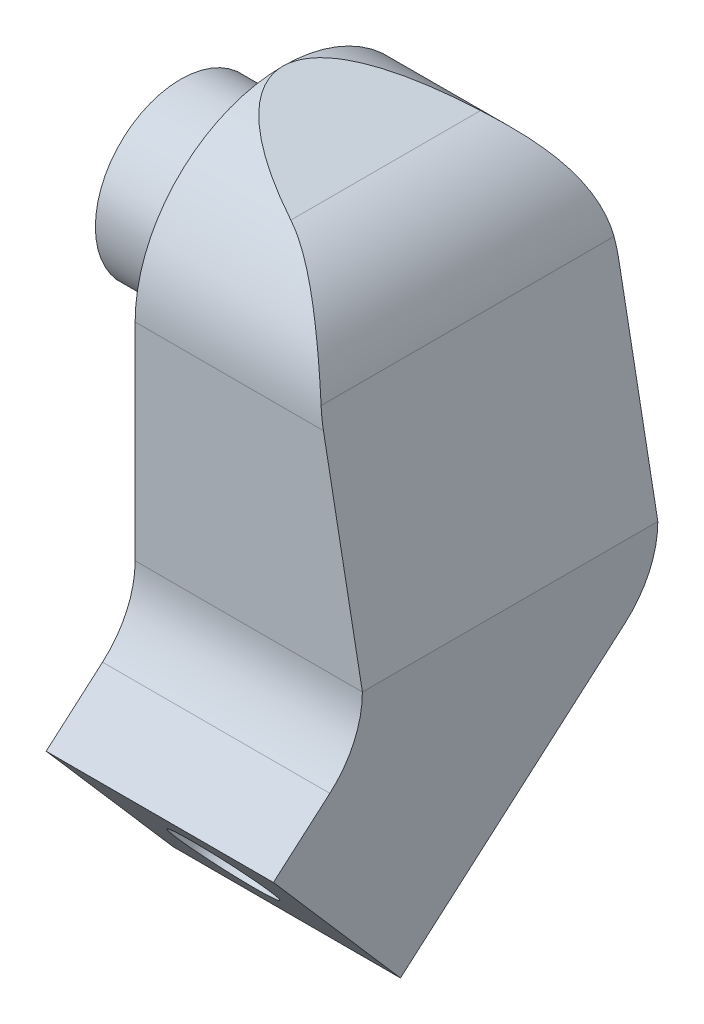
ISO-10303-21;
HEADER;
FILE_DESCRIPTION(('STEP AP214'),'2;1');
FILE_NAME('part.step','',(''),(''),'','','');
FILE_SCHEMA(('AUTOMOTIVE_DESIGN { 1 0 10303 214 1 1 1 1 }'));
ENDSEC;
DATA;
#1=APPLICATION_CONTEXT('core data for automotive mechanical design processes');
#2=APPLICATION_PROTOCOL_DEFINITION('international standard','automotive_design',2000,#1);
#3=PRODUCT_CONTEXT('',#1,'mechanical');
#4=PRODUCT('Part','Part','',(#3));
#5=PRODUCT_RELATED_PRODUCT_CATEGORY('part','',(#4));
#6=PRODUCT_DEFINITION_FORMATION('','',#4);
#7=PRODUCT_DEFINITION_CONTEXT('part definition',#1,'design');
#8=PRODUCT_DEFINITION('design','',#6,#7);
#9=PRODUCT_DEFINITION_SHAPE('','',#8);
#10=(LENGTH_UNIT() NAMED_UNIT(*) SI_UNIT(.MILLI.,.METRE.));
#11=(NAMED_UNIT(*) PLANE_ANGLE_UNIT() SI_UNIT($,.RADIAN.));
#12=(NAMED_UNIT(*) SI_UNIT($,.STERADIAN.) SOLID_ANGLE_UNIT());
#13=UNCERTAINTY_MEASURE_WITH_UNIT(LENGTH_MEASURE(1.E-05),#10,'distance_accuracy_value','');
#14=(GEOMETRIC_REPRESENTATION_CONTEXT(3) GLOBAL_UNCERTAINTY_ASSIGNED_CONTEXT((#13)) GLOBAL_UNIT_ASSIGNED_CONTEXT((#10,
#11,#12)) REPRESENTATION_CONTEXT('',''));
#15=CARTESIAN_POINT('',(0.,0.,0.));
#16=DIRECTION('',(0.,0.,1.));
#17=DIRECTION('',(1.,0.,0.));
#18=AXIS2_PLACEMENT_3D('',#15,#16,#17);
#19=CARTESIAN_POINT('',(6.,9.24472259806208,0.));
#20=DIRECTION('',(-1.,0.,0.));
#21=DIRECTION('',(0.,0.,1.));
#22=AXIS2_PLACEMENT_3D('',#19,#20,#21);
#23=CYLINDRICAL_SURFACE('',#22,7.8);
#24=CARTESIAN_POINT('',(-0.569888599863877,15.2243930559261,-5.00834715403681));
#25=CARTESIAN_POINT('',(-0.474869123652778,15.1925352213,-5.04638719464826));
#26=CARTESIAN_POINT('',(-0.381202871972687,15.158696050549,-5.08604791135388));
#27=CARTESIAN_POINT('',(-0.196562427398851,15.0872049518383,-5.16801210876022));
#28=CARTESIAN_POINT('',(-0.105587238832292,15.0495544574296,-5.21031459353764));
#29=CARTESIAN_POINT('',(0.163180124105426,14.9311819955664,-5.34021232860646));
#30=CARTESIAN_POINT('',(0.337076939679802,14.8449500549864,-5.43090643915444));
#31=CARTESIAN_POINT('',(0.675412376514924,14.6581481137479,-5.6171453697422));
#32=CARTESIAN_POINT('',(0.839804757384013,14.5575151447878,-5.71271023888794));
#33=CARTESIAN_POINT('',(1.15851280873125,14.3425197954466,-5.90536280209067));
#34=CARTESIAN_POINT('',(1.31282477114693,14.2281524063063,-6.00245104041017));
#35=CARTESIAN_POINT('',(1.61053493916151,13.9863599569609,-6.19521549453902));
#36=CARTESIAN_POINT('',(1.75397393804205,13.8589883909078,-6.29089577910444));
#37=CARTESIAN_POINT('',(2.03010271828314,13.5908835350614,-6.47902014934132));
#38=CARTESIAN_POINT('',(2.16279304431132,13.4501509230987,-6.57146439885746));
#39=CARTESIAN_POINT('',(2.41639993311986,13.1556294682544,-6.7508891111499));
#40=CARTESIAN_POINT('',(2.5373331723654,13.0018597150877,-6.83787724889714));
#41=CARTESIAN_POINT('',(2.76644673797915,12.681360140192,-7.00443491958694));
#42=CARTESIAN_POINT('',(2.8746314973217,12.5146348570974,-7.08400702924866));
#43=CARTESIAN_POINT('',(3.05190884759063,12.2113645915138,-7.21520744558215));
#44=CARTESIAN_POINT('',(3.12406878528015,12.0774936643756,-7.2688926254316));
#45=CARTESIAN_POINT('',(3.25961273719689,11.8031018963422,-7.36994263402898));
#46=CARTESIAN_POINT('',(3.32299897980834,11.6625827562022,-7.41730906753061));
#47=CARTESIAN_POINT('',(3.44010779408202,11.3758342613788,-7.50471678363874));
#48=CARTESIAN_POINT('',(3.49385550569836,11.2296210091986,-7.54477712733281));
#49=CARTESIAN_POINT('',(3.59113277117575,10.9319725815418,-7.61686283034689));
#50=CARTESIAN_POINT('',(3.63466922388612,10.7805410114146,-7.64889361554565));
#51=CARTESIAN_POINT('',(3.68762857824843,10.5671411865185,-7.68732197202193));
#52=CARTESIAN_POINT('',(3.7016618308161,10.5069429876775,-7.69743785534594));
#53=CARTESIAN_POINT('',(3.72803925954416,10.3859903636672,-7.71629772987771));
#54=CARTESIAN_POINT('',(3.74038410740754,10.3252361700141,-7.72504226685639));
#55=CARTESIAN_POINT('',(3.75187311922548,10.2642194353368,-7.73308646006152));
#56=B_SPLINE_CURVE_WITH_KNOTS('',3,(#24,#25,#26,#27,#28,#29,#30,#31,#32,#33,#34,#35,#36,#37,#38,
#39,#40,#41,#42,#43,#44,#45,#46,#47,#48,#49,#50,#51,#52,#53,#54,#55),.UNSPECIFIED.,.F.,.F.,(4,2,
2,2,2,2,2,2,2,2,2,2,2,2,2,4),(0.,0.321486333116528,0.642852191921794,1.28469364964235,
1.92943253957461,2.57440727527911,3.21682826619508,3.85921668331311,4.50068020813563,
5.141920017254,5.62530529136211,6.10856756684329,6.5905504222528,7.07220670016877,
7.26007797088733,7.44787428146098),.UNSPECIFIED.);
#57=CARTESIAN_POINT('',(-0.569888599863877,15.2243930559261,-5.00834715403681));
#58=VERTEX_POINT('',#57);
#59=CARTESIAN_POINT('',(3.75187311922548,10.2642194353368,-7.73308646006152));
#60=VERTEX_POINT('',#59);
#61=EDGE_CURVE('E11',#58,#60,#56,.T.);
#62=ORIENTED_EDGE('',*,*,#61,.T.);
#63=CARTESIAN_POINT('',(3.94383489943073,9.24472259806208,0.));
#64=DIRECTION('',(-0.98273115117596,-0.185039143178876,0.));
#65=DIRECTION('',(-0.185039143178876,0.98273115117596,0.));
#66=AXIS2_PLACEMENT_3D('',#63,#64,#65);
#67=ELLIPSE('',#66,7.93706395759037,7.8);
#68=CARTESIAN_POINT('',(3.94383489943073,9.24472259806208,-7.8));
#69=VERTEX_POINT('',#68);
#70=EDGE_CURVE('E142',#60,#69,#67,.T.);
#71=ORIENTED_EDGE('',*,*,#70,.T.);
#72=DIRECTION('',(-1.,0.,0.));
#73=VECTOR('',#72,1.);
#74=CARTESIAN_POINT('',(6.,9.24472259806208,-7.8));
#75=LINE('',#74,#73);
#76=CARTESIAN_POINT('',(-6.,9.24472259806208,-7.8));
#77=VERTEX_POINT('',#76);
#78=EDGE_CURVE('E165',#69,#77,#75,.T.);
#79=ORIENTED_EDGE('',*,*,#78,.T.);
#80=CARTESIAN_POINT('',(-6.,9.24472259806208,0.));
#81=DIRECTION('',(1.,0.,0.));
#82=DIRECTION('',(0.,0.,-1.));
#83=AXIS2_PLACEMENT_3D('',#80,#81,#82);
#84=CIRCLE('',#83,7.8);
#85=CARTESIAN_POINT('',(-6.,17.0447225980621,0.));
#86=VERTEX_POINT('',#85);
#87=EDGE_CURVE('E146',#77,#86,#84,.T.);
#88=ORIENTED_EDGE('',*,*,#87,.T.);
#89=CARTESIAN_POINT('',(17.2676929867115,9.24472259806208,0.));
#90=DIRECTION('',(-0.31784473285452,-0.948142777115682,0.));
#91=DIRECTION('',(-0.948142777115682,0.31784473285452,0.));
#92=AXIS2_PLACEMENT_3D('',#89,#90,#91);
#93=ELLIPSE('',#92,24.540283961761,7.8);
#94=EDGE_CURVE('E239',#86,#58,#93,.T.);
#95=ORIENTED_EDGE('',*,*,#94,.T.);
#96=EDGE_LOOP('',(#62,#71,#79,#88,#95));
#97=FACE_BOUND('',#96,.T.);
#98=ADVANCED_FACE('F43',(#97),#23,.T.);
#99=CARTESIAN_POINT('',(6.,-1.6754398150167,-2.8));
#100=DIRECTION('',(-1.,0.,0.));
#101=DIRECTION('',(0.,0.,1.));
#102=AXIS2_PLACEMENT_3D('',#99,#100,#101);
#103=CYLINDRICAL_SURFACE('',#102,5.);
#104=CARTESIAN_POINT('',(-6.,-1.6754398150167,-2.8));
#105=DIRECTION('',(1.,0.,0.));
#106=DIRECTION('',(0.,0.,1.));
#107=AXIS2_PLACEMENT_3D('',#104,#105,#106);
#108=CIRCLE('',#107,5.);
#109=CARTESIAN_POINT('',(-6.,-5.45029791743722,-6.07878732256152));
#110=VERTEX_POINT('',#109);
#111=CARTESIAN_POINT('',(-6.,-1.6754398150167,-7.8));
#112=VERTEX_POINT('',#111);
#113=EDGE_CURVE('E138',#110,#112,#108,.T.);
#114=ORIENTED_EDGE('',*,*,#113,.T.);
#115=DIRECTION('',(-1.,0.,0.));
#116=VECTOR('',#115,1.);
#117=CARTESIAN_POINT('',(6.,-1.6754398150167,-7.8));
#118=LINE('',#117,#116);
#119=CARTESIAN_POINT('',(6.,-1.6754398150167,-7.8));
#120=VERTEX_POINT('',#119);
#121=EDGE_CURVE('E167',#120,#112,#118,.T.);
#122=ORIENTED_EDGE('',*,*,#121,.F.);
#123=CARTESIAN_POINT('',(6.,-1.6754398150167,-2.8));
#124=DIRECTION('',(1.,0.,0.));
#125=DIRECTION('',(0.,0.,1.));
#126=AXIS2_PLACEMENT_3D('',#123,#124,#125);
#127=CIRCLE('',#126,5.);
#128=CARTESIAN_POINT('',(6.,-5.45029791743722,-6.07878732256152));
#129=VERTEX_POINT('',#128);
#130=EDGE_CURVE('E156',#129,#120,#127,.T.);
#131=ORIENTED_EDGE('',*,*,#130,.F.);
#132=DIRECTION('',(-1.,0.,0.));
#133=VECTOR('',#132,1.);
#134=CARTESIAN_POINT('',(6.,-5.45029791743722,-6.07878732256152));
#135=LINE('',#134,#133);
#136=EDGE_CURVE('E134',#129,#110,#135,.T.);
#137=ORIENTED_EDGE('',*,*,#136,.T.);
#138=EDGE_LOOP('',(#114,#122,#131,#137));
#139=FACE_BOUND('',#138,.T.);
#140=ADVANCED_FACE('F45',(#139),#103,.T.);
#141=CARTESIAN_POINT('',(6.,9.24472259806208,-7.8));
#142=DIRECTION('',(0.,0.,1.));
#143=DIRECTION('',(0.,-1.,0.));
#144=AXIS2_PLACEMENT_3D('',#141,#142,#143);
#145=PLANE('',#144);
#146=ORIENTED_EDGE('',*,*,#78,.F.);
#147=DIRECTION('',(0.185039143178876,-0.98273115117596,0.));
#148=VECTOR('',#147,1.);
#149=CARTESIAN_POINT('',(3.75187311922548,10.2642194353368,-7.8));
#150=LINE('',#149,#148);
#151=EDGE_CURVE('E255',#69,#120,#150,.T.);
#152=ORIENTED_EDGE('',*,*,#151,.T.);
#153=ORIENTED_EDGE('',*,*,#121,.T.);
#154=DIRECTION('',(0.,1.,0.));
#155=VECTOR('',#154,1.);
#156=CARTESIAN_POINT('',(-6.,9.24472259806208,-7.8));
#157=LINE('',#156,#155);
#158=EDGE_CURVE('E141',#112,#77,#157,.T.);
#159=ORIENTED_EDGE('',*,*,#158,.T.);
#160=EDGE_LOOP('',(#146,#152,#153,#159));
#161=FACE_BOUND('',#160,.T.);
#162=ADVANCED_FACE('F221',(#161),#145,.F.);
#163=DIRECTION('',(-1.,0.,0.));
#164=VECTOR('',#163,1.);
#165=CARTESIAN_POINT('',(6.,9.24472259806208,7.8));
#166=LINE('',#165,#164);
#167=CARTESIAN_POINT('',(3.94383489943073,9.24472259806208,7.8));
#168=VERTEX_POINT('',#167);
#169=CARTESIAN_POINT('',(-6.,9.24472259806208,7.8));
#170=VERTEX_POINT('',#169);
#171=EDGE_CURVE('E163',#168,#170,#166,.T.);
#172=ORIENTED_EDGE('',*,*,#171,.F.);
#173=CARTESIAN_POINT('',(3.75187311922548,10.2642194353368,7.73308646006152));
#174=VERTEX_POINT('',#173);
#175=EDGE_CURVE('E265',#168,#174,#67,.T.);
#176=ORIENTED_EDGE('',*,*,#175,.T.);
#177=CARTESIAN_POINT('',(3.75187311922548,10.2642194353368,7.73308646006152));
#178=CARTESIAN_POINT('',(3.7204048163751,10.4315270182391,7.71106678037564));
#179=CARTESIAN_POINT('',(3.68244296211925,10.5968262599391,7.68371544228033));
#180=CARTESIAN_POINT('',(3.59441622092415,10.9220114204765,7.61931633672893));
#181=CARTESIAN_POINT('',(3.54436676414164,11.0819039468354,7.58228092631337));
#182=CARTESIAN_POINT('',(3.43349119132947,11.3938289337235,7.49981149653999));
#183=CARTESIAN_POINT('',(3.37277139908648,11.5459213991866,7.45446016289032));
#184=CARTESIAN_POINT('',(3.24110731578682,11.8430908926255,7.35615232530246));
#185=CARTESIAN_POINT('',(3.17016000671038,11.9881658328763,7.303193576522));
#186=CARTESIAN_POINT('',(3.01929702490176,12.2699523560528,7.1910263933883));
#187=CARTESIAN_POINT('',(2.93942969868092,12.4067033590578,7.13185174409922));
#188=CARTESIAN_POINT('',(2.77123897457748,12.6722519809079,7.00810426930245));
#189=CARTESIAN_POINT('',(2.68291615345029,12.8010501412378,6.94353181202118));
#190=CARTESIAN_POINT('',(2.40562600857968,13.1760834404567,6.74276215414208));
#191=CARTESIAN_POINT('',(2.20477043308406,13.4101591717225,6.59984062847372));
#192=CARTESIAN_POINT('',(1.8656343217703,13.753797624586,6.36645170295095));
#193=CARTESIAN_POINT('',(1.73624788822433,13.8745377270638,6.27900241853668));
#194=CARTESIAN_POINT('',(1.46861083972131,14.1047078473151,6.10258426354993));
#195=CARTESIAN_POINT('',(1.33035817817422,14.2141352384404,6.01361504563355));
#196=CARTESIAN_POINT('',(1.04561744002922,14.4212711431412,5.83625717721029));
#197=CARTESIAN_POINT('',(0.899149139420456,14.5190061616669,5.74786766006554));
#198=CARTESIAN_POINT('',(0.59773074671236,14.7028216012863,5.57361477202827));
#199=CARTESIAN_POINT('',(0.442784550272186,14.788907313206,5.48775026830033));
#200=CARTESIAN_POINT('',(0.147686262560219,14.9372528552228,5.33336501026651));
#201=CARTESIAN_POINT('',(0.00872443012167869,15.0011540323875,5.26415448907808));
#202=CARTESIAN_POINT('',(-0.275682828668384,15.1197747128989,5.13144989219216));
#203=CARTESIAN_POINT('',(-0.421128470721406,15.1744939104933,5.06795600688656));
#204=CARTESIAN_POINT('',(-0.569888599863877,15.2243930559261,5.00834715403681));
#205=B_SPLINE_CURVE_WITH_KNOTS('',3,(#177,#178,#179,#180,#181,#182,#183,#184,#185,#186,#187,
#188,#189,#190,#191,#192,#193,#194,#195,#196,#197,#198,#199,#200,#201,#202,#203,#204),
.UNSPECIFIED.,.F.,.F.,(4,2,2,2,2,2,2,2,2,2,2,2,2,4),(0.,0.514643219595289,1.02863292344266,
1.53776477500476,2.04704717409246,2.55369218835678,3.06030266858961,4.0763938985231,
4.66818201622088,5.26010723141691,5.85066413552059,6.44095191661889,6.94414664763426,
7.447358131297),.UNSPECIFIED.);
#206=CARTESIAN_POINT('',(-0.569888599863877,15.2243930559261,5.00834715403681));
#207=VERTEX_POINT('',#206);
#208=EDGE_CURVE('E53',#174,#207,#205,.T.);
#209=ORIENTED_EDGE('',*,*,#208,.T.);
#210=EDGE_CURVE('E254',#207,#86,#93,.T.);
#211=ORIENTED_EDGE('',*,*,#210,.T.);
#212=EDGE_CURVE('E145',#86,#170,#84,.T.);
#213=ORIENTED_EDGE('',*,*,#212,.T.);
#214=EDGE_LOOP('',(#172,#176,#209,#211,#213));
#215=FACE_BOUND('',#214,.T.);
#216=ADVANCED_FACE('F181',(#215),#23,.T.);
#217=CARTESIAN_POINT('',(6.,9.24472259806208,7.8));
#218=DIRECTION('',(0.,0.,-1.));
#219=DIRECTION('',(0.,1.,0.));
#220=AXIS2_PLACEMENT_3D('',#217,#218,#219);
#221=PLANE('',#220);
#222=DIRECTION('',(-1.,0.,0.));
#223=VECTOR('',#222,1.);
#224=CARTESIAN_POINT('',(6.,-1.6754398150167,7.8));
#225=LINE('',#224,#223);
#226=CARTESIAN_POINT('',(6.,-1.6754398150167,7.8));
#227=VERTEX_POINT('',#226);
#228=CARTESIAN_POINT('',(-6.,-1.6754398150167,7.8));
#229=VERTEX_POINT('',#228);
#230=EDGE_CURVE('E160',#227,#229,#225,.T.);
#231=ORIENTED_EDGE('',*,*,#230,.F.);
#232=DIRECTION('',(-0.185039143178876,0.98273115117596,0.));
#233=VECTOR('',#232,1.);
#234=CARTESIAN_POINT('',(4.01423693253833,8.87082186629056,7.8));
#235=LINE('',#234,#233);
#236=EDGE_CURVE('E106',#227,#168,#235,.T.);
#237=ORIENTED_EDGE('',*,*,#236,.T.);
#238=ORIENTED_EDGE('',*,*,#171,.T.);
#239=DIRECTION('',(0.,-1.,0.));
#240=VECTOR('',#239,1.);
#241=CARTESIAN_POINT('',(-6.,9.24472259806208,7.8));
#242=LINE('',#241,#240);
#243=EDGE_CURVE('E149',#170,#229,#242,.T.);
#244=ORIENTED_EDGE('',*,*,#243,.T.);
#245=EDGE_LOOP('',(#231,#237,#238,#244));
#246=FACE_BOUND('',#245,.T.);
#247=ADVANCED_FACE('F214',(#246),#221,.F.);
#248=CARTESIAN_POINT('',(6.,-1.6754398150167,12.8));
#249=DIRECTION('',(-1.,0.,0.));
#250=DIRECTION('',(0.,0.,1.));
#251=AXIS2_PLACEMENT_3D('',#248,#249,#250);
#252=CYLINDRICAL_SURFACE('',#251,5.);
#253=CARTESIAN_POINT('',(-6.,-1.6754398150167,12.8));
#254=DIRECTION('',(-1.,0.,0.));
#255=DIRECTION('',(0.,0.,1.));
#256=AXIS2_PLACEMENT_3D('',#253,#254,#255);
#257=CIRCLE('',#256,5.);
#258=CARTESIAN_POINT('',(-6.,-5.45029791743723,9.52121267743848));
#259=VERTEX_POINT('',#258);
#260=EDGE_CURVE('E151',#229,#259,#257,.T.);
#261=ORIENTED_EDGE('',*,*,#260,.T.);
#262=DIRECTION('',(-1.,0.,0.));
#263=VECTOR('',#262,1.);
#264=CARTESIAN_POINT('',(6.,-5.45029791743723,9.52121267743848));
#265=LINE('',#264,#263);
#266=CARTESIAN_POINT('',(6.,-5.45029791743723,9.52121267743848));
#267=VERTEX_POINT('',#266);
#268=EDGE_CURVE('E129',#267,#259,#265,.T.);
#269=ORIENTED_EDGE('',*,*,#268,.F.);
#270=CARTESIAN_POINT('',(6.,-1.6754398150167,12.8));
#271=DIRECTION('',(-1.,0.,0.));
#272=DIRECTION('',(0.,0.,1.));
#273=AXIS2_PLACEMENT_3D('',#270,#271,#272);
#274=CIRCLE('',#273,5.);
#275=EDGE_CURVE('E120',#227,#267,#274,.T.);
#276=ORIENTED_EDGE('',*,*,#275,.F.);
#277=ORIENTED_EDGE('',*,*,#230,.T.);
#278=EDGE_LOOP('',(#261,#269,#276,#277));
#279=FACE_BOUND('',#278,.T.);
#280=ADVANCED_FACE('F212',(#279),#252,.F.);
#281=CARTESIAN_POINT('',(6.,-5.45029791743723,9.52121267743848));
#282=DIRECTION('',(0.,-0.754971620484105,-0.655757464512304));
#283=DIRECTION('',(0.,0.655757464512304,-0.754971620484105));
#284=AXIS2_PLACEMENT_3D('',#281,#282,#283);
#285=PLANE('',#284);
#286=DIRECTION('',(0.,-0.655757464512304,0.754971620484104));
#287=VECTOR('',#286,1.);
#288=CARTESIAN_POINT('',(-6.,-5.45029791743723,9.52121267743848));
#289=LINE('',#288,#287);
#290=CARTESIAN_POINT('',(-6.,-8.03569066337192,12.4977676640261));
#291=VERTEX_POINT('',#290);
#292=EDGE_CURVE('E128',#259,#291,#289,.T.);
#293=ORIENTED_EDGE('',*,*,#292,.T.);
#294=DIRECTION('',(-1.,0.,0.));
#295=VECTOR('',#294,1.);
#296=CARTESIAN_POINT('',(6.,-8.03569066337192,12.4977676640261));
#297=LINE('',#296,#295);
#298=CARTESIAN_POINT('',(6.,-8.03569066337192,12.4977676640261));
#299=VERTEX_POINT('',#298);
#300=EDGE_CURVE('E125',#299,#291,#297,.T.);
#301=ORIENTED_EDGE('',*,*,#300,.F.);
#302=DIRECTION('',(0.,-0.655757464512304,0.754971620484104));
#303=VECTOR('',#302,1.);
#304=CARTESIAN_POINT('',(6.,-5.45029791743723,9.52121267743848));
#305=LINE('',#304,#303);
#306=EDGE_CURVE('E114',#267,#299,#305,.T.);
#307=ORIENTED_EDGE('',*,*,#306,.F.);
#308=ORIENTED_EDGE('',*,*,#268,.T.);
#309=EDGE_LOOP('',(#293,#301,#307,#308));
#310=FACE_BOUND('',#309,.T.);
#311=ADVANCED_FACE('F126',(#310),#285,.F.);
#312=CARTESIAN_POINT('',(6.,-15.7589117631594,5.78948916871389));
#313=DIRECTION('',(0.,0.655757464512303,-0.754971620484105));
#314=DIRECTION('',(0.,0.754971620484105,0.655757464512303));
#315=AXIS2_PLACEMENT_3D('',#312,#313,#314);
#316=PLANE('',#315);
#317=CARTESIAN_POINT('',(0.,-11.9011453602505,9.14028944572313));
#318=DIRECTION('',(0.,0.655757464512303,-0.754971620484105));
#319=DIRECTION('',(0.,0.754971620484105,0.655757464512303));
#320=AXIS2_PLACEMENT_3D('',#317,#318,#319);
#321=CIRCLE('',#320,2.5);
#322=CARTESIAN_POINT('',(0.,-10.0137163090403,10.7796831070039));
#323=VERTEX_POINT('',#322);
#324=EDGE_CURVE('E47',#323,#323,#321,.F.);
#325=ORIENTED_EDGE('',*,*,#324,.F.);
#326=EDGE_LOOP('',(#325));
#327=FACE_BOUND('',#326,.T.);
#328=DIRECTION('',(0.,-0.754971620484105,-0.655757464512303));
#329=VECTOR('',#328,1.);
#330=CARTESIAN_POINT('',(-6.,-15.7589117631594,5.78948916871389));
#331=LINE('',#330,#329);
#332=CARTESIAN_POINT('',(-6.,-15.7589117631594,5.78948916871389));
#333=VERTEX_POINT('',#332);
#334=EDGE_CURVE('E91',#291,#333,#331,.T.);
#335=ORIENTED_EDGE('',*,*,#334,.T.);
#336=DIRECTION('',(-1.,0.,0.));
#337=VECTOR('',#336,1.);
#338=CARTESIAN_POINT('',(6.,-15.7589117631594,5.78948916871389));
#339=LINE('',#338,#337);
#340=CARTESIAN_POINT('',(6.,-15.7589117631594,5.78948916871389));
#341=VERTEX_POINT('',#340);
#342=EDGE_CURVE('E130',#341,#333,#339,.T.);
#343=ORIENTED_EDGE('',*,*,#342,.F.);
#344=DIRECTION('',(0.,-0.754971620484105,-0.655757464512303));
#345=VECTOR('',#344,1.);
#346=CARTESIAN_POINT('',(6.,-15.7589117631594,5.78948916871389));
#347=LINE('',#346,#345);
#348=EDGE_CURVE('E118',#299,#341,#347,.T.);
#349=ORIENTED_EDGE('',*,*,#348,.F.);
#350=ORIENTED_EDGE('',*,*,#300,.T.);
#351=EDGE_LOOP('',(#335,#343,#349,#350));
#352=FACE_BOUND('',#351,.T.);
#353=ADVANCED_FACE('F132',(#327,#352),#316,.F.);
#354=CARTESIAN_POINT('',(6.,-5.45029791743722,-6.07878732256152));
#355=DIRECTION('',(0.,0.754971620484105,0.655757464512303));
#356=DIRECTION('',(0.,-0.655757464512303,0.754971620484105));
#357=AXIS2_PLACEMENT_3D('',#354,#355,#356);
#358=PLANE('',#357);
#359=DIRECTION('',(0.,0.655757464512303,-0.754971620484105));
#360=VECTOR('',#359,1.);
#361=CARTESIAN_POINT('',(-6.,-5.45029791743722,-6.07878732256152));
#362=LINE('',#361,#360);
#363=EDGE_CURVE('E97',#333,#110,#362,.T.);
#364=ORIENTED_EDGE('',*,*,#363,.T.);
#365=ORIENTED_EDGE('',*,*,#136,.F.);
#366=DIRECTION('',(0.,0.655757464512303,-0.754971620484105));
#367=VECTOR('',#366,1.);
#368=CARTESIAN_POINT('',(6.,-5.45029791743722,-6.07878732256152));
#369=LINE('',#368,#367);
#370=EDGE_CURVE('E61',#341,#129,#369,.T.);
#371=ORIENTED_EDGE('',*,*,#370,.F.);
#372=ORIENTED_EDGE('',*,*,#342,.T.);
#373=EDGE_LOOP('',(#364,#365,#371,#372));
#374=FACE_BOUND('',#373,.T.);
#375=ADVANCED_FACE('F201',(#374),#358,.F.);
#376=CARTESIAN_POINT('',(6.,-1.6754398150167,-2.8));
#377=DIRECTION('',(-1.,0.,0.));
#378=DIRECTION('',(0.,0.,1.));
#379=AXIS2_PLACEMENT_3D('',#376,#377,#378);
#380=PLANE('',#379);
#381=ORIENTED_EDGE('',*,*,#130,.T.);
#382=DIRECTION('',(0.,0.,1.));
#383=VECTOR('',#382,1.);
#384=CARTESIAN_POINT('',(6.,-1.6754398150167,-7.8));
#385=LINE('',#384,#383);
#386=EDGE_CURVE('E257',#120,#227,#385,.T.);
#387=ORIENTED_EDGE('',*,*,#386,.T.);
#388=ORIENTED_EDGE('',*,*,#275,.T.);
#389=ORIENTED_EDGE('',*,*,#306,.T.);
#390=ORIENTED_EDGE('',*,*,#348,.T.);
#391=ORIENTED_EDGE('',*,*,#370,.T.);
#392=EDGE_LOOP('',(#381,#387,#388,#389,#390,#391));
#393=FACE_BOUND('',#392,.T.);
#394=ADVANCED_FACE('F116',(#393),#380,.F.);
#395=CARTESIAN_POINT('',(-6.,-1.6754398150167,-2.8));
#396=DIRECTION('',(-1.,0.,0.));
#397=DIRECTION('',(0.,0.,1.));
#398=AXIS2_PLACEMENT_3D('',#395,#396,#397);
#399=PLANE('',#398);
#400=CARTESIAN_POINT('',(-6.,9.24472259806208,0.));
#401=DIRECTION('',(-1.,0.,0.));
#402=DIRECTION('',(0.,0.,1.));
#403=AXIS2_PLACEMENT_3D('',#400,#401,#402);
#404=CIRCLE('',#403,4.5);
#405=CARTESIAN_POINT('',(-6.,9.24472259806208,-4.5));
#406=VERTEX_POINT('',#405);
#407=EDGE_CURVE('E290',#406,#406,#404,.T.);
#408=ORIENTED_EDGE('',*,*,#407,.F.);
#409=EDGE_LOOP('',(#408));
#410=FACE_BOUND('',#409,.T.);
#411=ORIENTED_EDGE('',*,*,#113,.F.);
#412=ORIENTED_EDGE('',*,*,#363,.F.);
#413=ORIENTED_EDGE('',*,*,#334,.F.);
#414=ORIENTED_EDGE('',*,*,#292,.F.);
#415=ORIENTED_EDGE('',*,*,#260,.F.);
#416=ORIENTED_EDGE('',*,*,#243,.F.);
#417=ORIENTED_EDGE('',*,*,#212,.F.);
#418=ORIENTED_EDGE('',*,*,#87,.F.);
#419=ORIENTED_EDGE('',*,*,#158,.F.);
#420=EDGE_LOOP('',(#411,#412,#413,#414,#415,#416,#417,#418,#419));
#421=FACE_BOUND('',#420,.T.);
#422=ADVANCED_FACE('F190',(#410,#421),#399,.T.);
#423=CARTESIAN_POINT('',(-2.63587936341826,9.06146500467414,-7.8));
#424=DIRECTION('',(0.,0.,1.));
#425=DIRECTION('',(1.,0.,0.));
#426=AXIS2_PLACEMENT_3D('',#423,#424,#425);
#427=CYLINDRICAL_SURFACE('',#426,6.5);
#428=DIRECTION('',(0.,0.,1.));
#429=VECTOR('',#428,1.);
#430=CARTESIAN_POINT('',(-0.569888599863877,15.2243930559261,-7.8));
#431=LINE('',#430,#429);
#432=EDGE_CURVE('E247',#58,#207,#431,.T.);
#433=ORIENTED_EDGE('',*,*,#432,.T.);
#434=ORIENTED_EDGE('',*,*,#208,.F.);
#435=DIRECTION('',(0.,0.,1.));
#436=VECTOR('',#435,1.);
#437=CARTESIAN_POINT('',(3.75187311922548,10.2642194353368,-7.8));
#438=LINE('',#437,#436);
#439=EDGE_CURVE('E249',#60,#174,#438,.T.);
#440=ORIENTED_EDGE('',*,*,#439,.F.);
#441=ORIENTED_EDGE('',*,*,#61,.F.);
#442=EDGE_LOOP('',(#433,#434,#440,#441));
#443=FACE_BOUND('',#442,.T.);
#444=ADVANCED_FACE('F184',(#443),#427,.T.);
#445=CARTESIAN_POINT('',(3.75187311922548,10.2642194353368,-7.8));
#446=DIRECTION('',(-0.98273115117596,-0.185039143178876,0.));
#447=DIRECTION('',(0.185039143178876,-0.98273115117596,0.));
#448=AXIS2_PLACEMENT_3D('',#445,#446,#447);
#449=PLANE('',#448);
#450=ORIENTED_EDGE('',*,*,#439,.T.);
#451=ORIENTED_EDGE('',*,*,#175,.F.);
#452=ORIENTED_EDGE('',*,*,#236,.F.);
#453=ORIENTED_EDGE('',*,*,#386,.F.);
#454=ORIENTED_EDGE('',*,*,#151,.F.);
#455=ORIENTED_EDGE('',*,*,#70,.F.);
#456=EDGE_LOOP('',(#450,#451,#452,#453,#454,#455));
#457=FACE_BOUND('',#456,.T.);
#458=ADVANCED_FACE('F189',(#457),#449,.F.);
#459=CARTESIAN_POINT('',(-6.,17.0447225980621,-7.8));
#460=DIRECTION('',(-0.31784473285452,-0.948142777115682,0.));
#461=DIRECTION('',(0.948142777115682,-0.31784473285452,0.));
#462=AXIS2_PLACEMENT_3D('',#459,#460,#461);
#463=PLANE('',#462);
#464=ORIENTED_EDGE('',*,*,#210,.F.);
#465=ORIENTED_EDGE('',*,*,#432,.F.);
#466=ORIENTED_EDGE('',*,*,#94,.F.);
#467=EDGE_LOOP('',(#464,#465,#466));
#468=FACE_BOUND('',#467,.T.);
#469=ADVANCED_FACE('F193',(#468),#463,.F.);
#470=CARTESIAN_POINT('',(0.,-15.2222683101381,12.9638884300951));
#471=DIRECTION('',(0.,0.655757464512303,-0.754971620484105));
#472=DIRECTION('',(0.,0.754971620484105,0.655757464512304));
#473=AXIS2_PLACEMENT_3D('',#470,#471,#472);
#474=CYLINDRICAL_SURFACE('',#473,2.5);
#475=CARTESIAN_POINT('',(0.,-8.3600550518841,5.06344269510896));
#476=DIRECTION('',(0.,-0.655757464512304,0.754971620484105));
#477=DIRECTION('',(0.,-0.754971620484105,-0.655757464512304));
#478=AXIS2_PLACEMENT_3D('',#475,#476,#477);
#479=CIRCLE('',#478,2.5);
#480=CARTESIAN_POINT('',(0.,-10.2474841030944,3.42404903382821));
#481=VERTEX_POINT('',#480);
#482=EDGE_CURVE('E286',#481,#481,#479,.T.);
#483=ORIENTED_EDGE('',*,*,#482,.F.);
#484=EDGE_LOOP('',(#483));
#485=FACE_BOUND('',#484,.T.);
#486=ORIENTED_EDGE('',*,*,#324,.T.);
#487=EDGE_LOOP('',(#486));
#488=FACE_BOUND('',#487,.T.);
#489=ADVANCED_FACE('F197',(#485,#488),#474,.F.);
#490=CARTESIAN_POINT('',(0.,-8.3600550518841,5.06344269510896));
#491=DIRECTION('',(0.,-0.655757464512304,0.754971620484105));
#492=DIRECTION('',(0.,-0.754971620484105,-0.655757464512304));
#493=AXIS2_PLACEMENT_3D('',#490,#491,#492);
#494=PLANE('',#493);
#495=ORIENTED_EDGE('',*,*,#482,.T.);
#496=EDGE_LOOP('',(#495));
#497=FACE_BOUND('',#496,.T.);
#498=ADVANCED_FACE('F301',(#497),#494,.T.);
#499=CARTESIAN_POINT('',(-11.4,9.24472259806208,0.));
#500=DIRECTION('',(1.,0.,0.));
#501=DIRECTION('',(0.,0.,-1.));
#502=AXIS2_PLACEMENT_3D('',#499,#500,#501);
#503=CYLINDRICAL_SURFACE('',#502,4.5);
#504=CARTESIAN_POINT('',(-11.4,9.24472259806208,0.));
#505=DIRECTION('',(-1.,0.,0.));
#506=DIRECTION('',(0.,0.,1.));
#507=AXIS2_PLACEMENT_3D('',#504,#505,#506);
#508=CIRCLE('',#507,4.5);
#509=CARTESIAN_POINT('',(-11.4,9.24472259806208,-4.5));
#510=VERTEX_POINT('',#509);
#511=EDGE_CURVE('E289',#510,#510,#508,.T.);
#512=CARTESIAN_POINT('',(-11.4,9.24472259806208,-4.5));
#513=CARTESIAN_POINT('',(-11.34375,9.24472259806208,-4.5));
#514=CARTESIAN_POINT('',(-11.2875,9.24472259806208,-4.5));
#515=CARTESIAN_POINT('',(-11.175,9.24472259806208,-4.5));
#516=CARTESIAN_POINT('',(-11.11875,9.24472259806208,-4.5));
#517=CARTESIAN_POINT('',(-11.00625,9.24472259806208,-4.5));
#518=CARTESIAN_POINT('',(-10.95,9.24472259806208,-4.5));
#519=CARTESIAN_POINT('',(-10.8375,9.24472259806208,-4.5));
#520=CARTESIAN_POINT('',(-10.78125,9.24472259806208,-4.5));
#521=CARTESIAN_POINT('',(-10.66875,9.24472259806208,-4.5));
#522=CARTESIAN_POINT('',(-10.6125,9.24472259806208,-4.5));
#523=CARTESIAN_POINT('',(-10.5,9.24472259806208,-4.5));
#524=CARTESIAN_POINT('',(-10.44375,9.24472259806208,-4.5));
#525=CARTESIAN_POINT('',(-10.33125,9.24472259806208,-4.5));
#526=CARTESIAN_POINT('',(-10.275,9.24472259806208,-4.5));
#527=CARTESIAN_POINT('',(-10.1625,9.24472259806208,-4.5));
#528=CARTESIAN_POINT('',(-10.10625,9.24472259806208,-4.5));
#529=CARTESIAN_POINT('',(-9.99375,9.24472259806208,-4.5));
#530=CARTESIAN_POINT('',(-9.9375,9.24472259806208,-4.5));
#531=CARTESIAN_POINT('',(-9.825,9.24472259806208,-4.5));
#532=CARTESIAN_POINT('',(-9.76875,9.24472259806208,-4.5));
#533=CARTESIAN_POINT('',(-9.65625,9.24472259806208,-4.5));
#534=CARTESIAN_POINT('',(-9.6,9.24472259806208,-4.5));
#535=CARTESIAN_POINT('',(-9.4875,9.24472259806208,-4.5));
#536=CARTESIAN_POINT('',(-9.43125,9.24472259806208,-4.5));
#537=CARTESIAN_POINT('',(-9.31875,9.24472259806208,-4.5));
#538=CARTESIAN_POINT('',(-9.2625,9.24472259806208,-4.5));
#539=CARTESIAN_POINT('',(-9.15,9.24472259806208,-4.5));
#540=CARTESIAN_POINT('',(-9.09375,9.24472259806208,-4.5));
#541=CARTESIAN_POINT('',(-8.98125,9.24472259806208,-4.5));
#542=CARTESIAN_POINT('',(-8.925,9.24472259806208,-4.5));
#543=CARTESIAN_POINT('',(-8.8125,9.24472259806208,-4.5));
#544=CARTESIAN_POINT('',(-8.75625,9.24472259806208,-4.5));
#545=CARTESIAN_POINT('',(-8.64375,9.24472259806208,-4.5));
#546=CARTESIAN_POINT('',(-8.5875,9.24472259806208,-4.5));
#547=CARTESIAN_POINT('',(-8.475,9.24472259806208,-4.5));
#548=CARTESIAN_POINT('',(-8.41875,9.24472259806208,-4.5));
#549=CARTESIAN_POINT('',(-8.30625,9.24472259806208,-4.5));
#550=CARTESIAN_POINT('',(-8.25,9.24472259806208,-4.5));
#551=CARTESIAN_POINT('',(-8.1375,9.24472259806208,-4.5));
#552=CARTESIAN_POINT('',(-8.08125,9.24472259806208,-4.5));
#553=CARTESIAN_POINT('',(-7.96875,9.24472259806208,-4.5));
#554=CARTESIAN_POINT('',(-7.9125,9.24472259806208,-4.5));
#555=CARTESIAN_POINT('',(-7.8,9.24472259806208,-4.5));
#556=CARTESIAN_POINT('',(-7.74375,9.24472259806208,-4.5));
#557=CARTESIAN_POINT('',(-7.63125,9.24472259806208,-4.5));
#558=CARTESIAN_POINT('',(-7.575,9.24472259806208,-4.5));
#559=CARTESIAN_POINT('',(-7.4625,9.24472259806208,-4.5));
#560=CARTESIAN_POINT('',(-7.40625,9.24472259806208,-4.5));
#561=CARTESIAN_POINT('',(-7.29375,9.24472259806208,-4.5));
#562=CARTESIAN_POINT('',(-7.2375,9.24472259806208,-4.5));
#563=CARTESIAN_POINT('',(-7.125,9.24472259806208,-4.5));
#564=CARTESIAN_POINT('',(-7.06875,9.24472259806208,-4.5));
#565=CARTESIAN_POINT('',(-6.95625,9.24472259806208,-4.5));
#566=CARTESIAN_POINT('',(-6.9,9.24472259806208,-4.5));
#567=CARTESIAN_POINT('',(-6.7875,9.24472259806208,-4.5));
#568=CARTESIAN_POINT('',(-6.73125,9.24472259806208,-4.5));
#569=CARTESIAN_POINT('',(-6.61875,9.24472259806208,-4.5));
#570=CARTESIAN_POINT('',(-6.5625,9.24472259806208,-4.5));
#571=CARTESIAN_POINT('',(-6.45,9.24472259806208,-4.5));
#572=CARTESIAN_POINT('',(-6.39375,9.24472259806208,-4.5));
#573=CARTESIAN_POINT('',(-6.28125,9.24472259806208,-4.5));
#574=CARTESIAN_POINT('',(-6.225,9.24472259806208,-4.5));
#575=CARTESIAN_POINT('',(-6.1125,9.24472259806208,-4.5));
#576=CARTESIAN_POINT('',(-6.05625,9.24472259806208,-4.5));
#577=CARTESIAN_POINT('',(-6.,9.24472259806208,-4.5));
#578=B_SPLINE_CURVE_WITH_KNOTS('',3,(#512,#513,#514,#515,#516,#517,#518,#519,#520,#521,#522,
#523,#524,#525,#526,#527,#528,#529,#530,#531,#532,#533,#534,#535,#536,#537,#538,#539,#540,#541,
#542,#543,#544,#545,#546,#547,#548,#549,#550,#551,#552,#553,#554,#555,#556,#557,#558,#559,#560,
#561,#562,#563,#564,#565,#566,#567,#568,#569,#570,#571,#572,#573,#574,#575,#576,#577),
.UNSPECIFIED.,.F.,.F.,(4,2,2,2,2,2,2,2,2,2,2,2,2,2,2,2,2,2,2,2,2,2,2,2,2,2,2,2,2,2,2,2,4),(0.,
0.168749999999999,0.337499999999999,0.50625,0.674999999999998,0.843749999999999,1.0125,1.18125,
1.35,1.51875,1.6875,1.85625,2.025,2.19375,2.3625,2.53125,2.7,2.86875,3.0375,3.20625,3.375,
3.54375,3.7125,3.88125,4.05,4.21875,4.3875,4.55625,4.725,4.89375,5.0625,5.23125,5.4),.UNSPECIFIED.);
#579=EDGE_CURVE('BSEAM298',#510,#406,#578,.T.);
#580=ORIENTED_EDGE('',*,*,#511,.F.);
#581=ORIENTED_EDGE('',*,*,#407,.T.);
#582=ORIENTED_EDGE('',*,*,#579,.T.);
#583=ORIENTED_EDGE('',*,*,#579,.F.);
#584=EDGE_LOOP('',(#580,#582,#581,#583));
#585=FACE_BOUND('',#584,.T.);
#586=ADVANCED_FACE('F298',(#585),#503,.T.);
#587=CARTESIAN_POINT('',(-11.4,9.24472259806208,0.));
#588=DIRECTION('',(-1.,0.,0.));
#589=DIRECTION('',(0.,0.,1.));
#590=AXIS2_PLACEMENT_3D('',#587,#588,#589);
#591=PLANE('',#590);
#592=ORIENTED_EDGE('',*,*,#511,.T.);
#593=EDGE_LOOP('',(#592));
#594=FACE_BOUND('',#593,.T.);
#595=ADVANCED_FACE('F296',(#594),#591,.T.);
#596=CLOSED_SHELL('',(#98,#140,#162,#216,#247,#280,#311,#353,#375,#394,#422,#444,#458,#469,#489,
#498,#586,#595));
#597=MANIFOLD_SOLID_BREP('B2',#596);
#598=ADVANCED_BREP_SHAPE_REPRESENTATION('',(#18,#597),#14);
#599=SHAPE_DEFINITION_REPRESENTATION(#9,#598);
ENDSEC;
END-ISO-10303-21;
